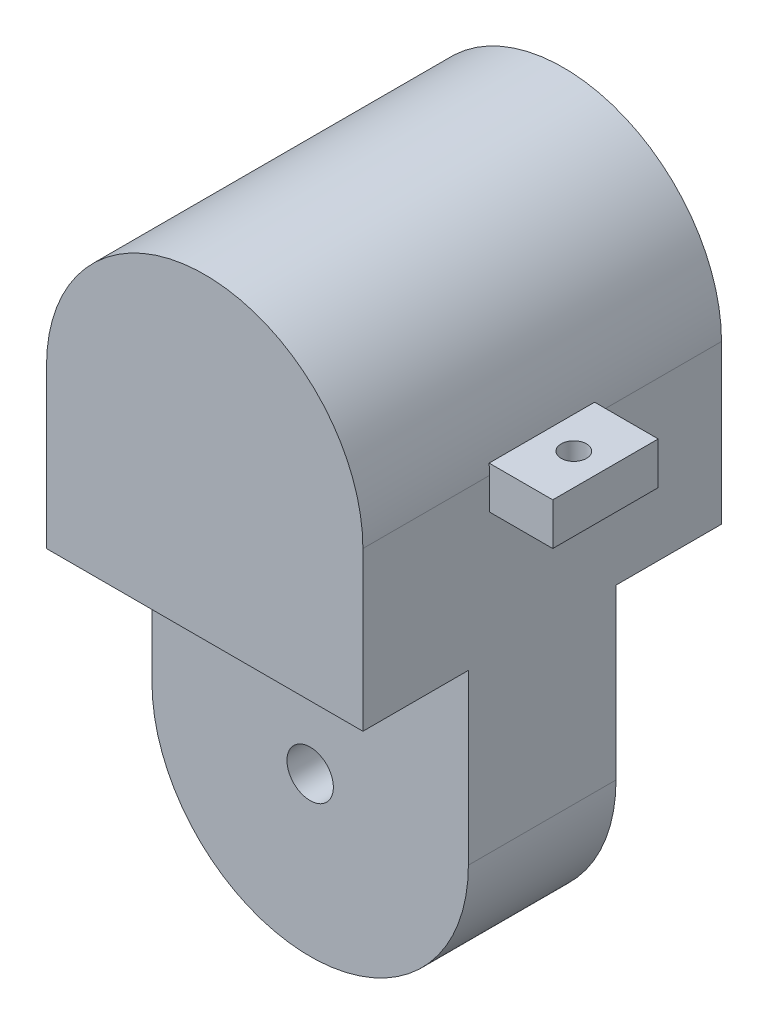
ISO-10303-21;
HEADER;
FILE_DESCRIPTION(('STEP AP214'),'2;1');
FILE_NAME('part.step','',(''),(''),'','','');
FILE_SCHEMA(('AUTOMOTIVE_DESIGN { 1 0 10303 214 1 1 1 1 }'));
ENDSEC;
DATA;
#1=APPLICATION_CONTEXT('core data for automotive mechanical design processes');
#2=APPLICATION_PROTOCOL_DEFINITION('international standard','automotive_design',2000,#1);
#3=PRODUCT_CONTEXT('',#1,'mechanical');
#4=PRODUCT('Part','Part','',(#3));
#5=PRODUCT_RELATED_PRODUCT_CATEGORY('part','',(#4));
#6=PRODUCT_DEFINITION_FORMATION('','',#4);
#7=PRODUCT_DEFINITION_CONTEXT('part definition',#1,'design');
#8=PRODUCT_DEFINITION('design','',#6,#7);
#9=PRODUCT_DEFINITION_SHAPE('','',#8);
#10=(LENGTH_UNIT() NAMED_UNIT(*) SI_UNIT(.MILLI.,.METRE.));
#11=(NAMED_UNIT(*) PLANE_ANGLE_UNIT() SI_UNIT($,.RADIAN.));
#12=(NAMED_UNIT(*) SI_UNIT($,.STERADIAN.) SOLID_ANGLE_UNIT());
#13=UNCERTAINTY_MEASURE_WITH_UNIT(LENGTH_MEASURE(1.E-05),#10,'distance_accuracy_value','');
#14=(GEOMETRIC_REPRESENTATION_CONTEXT(3) GLOBAL_UNCERTAINTY_ASSIGNED_CONTEXT((#13)) GLOBAL_UNIT_ASSIGNED_CONTEXT((#10,
#11,#12)) REPRESENTATION_CONTEXT('',''));
#15=CARTESIAN_POINT('',(0.,0.,0.));
#16=DIRECTION('',(0.,0.,1.));
#17=DIRECTION('',(1.,0.,0.));
#18=AXIS2_PLACEMENT_3D('',#15,#16,#17);
#19=CARTESIAN_POINT('',(7.5,0.,8.5));
#20=DIRECTION('',(-1.,0.,0.));
#21=DIRECTION('',(0.,0.,1.));
#22=AXIS2_PLACEMENT_3D('',#19,#20,#21);
#23=PLANE('',#22);
#24=DIRECTION('',(0.,0.,-1.));
#25=VECTOR('',#24,1.);
#26=CARTESIAN_POINT('',(7.5,14.,8.5));
#27=LINE('',#26,#25);
#28=CARTESIAN_POINT('',(7.5,14.,2.5));
#29=VERTEX_POINT('',#28);
#30=CARTESIAN_POINT('',(7.5,14.,-2.5));
#31=VERTEX_POINT('',#30);
#32=EDGE_CURVE('E11',#29,#31,#27,.T.);
#33=ORIENTED_EDGE('',*,*,#32,.F.);
#34=DIRECTION('',(0.,1.,0.));
#35=VECTOR('',#34,1.);
#36=CARTESIAN_POINT('',(7.5,0.,2.5));
#37=LINE('',#36,#35);
#38=CARTESIAN_POINT('',(7.5,15.5,2.5));
#39=VERTEX_POINT('',#38);
#40=EDGE_CURVE('E138',#29,#39,#37,.T.);
#41=ORIENTED_EDGE('',*,*,#40,.T.);
#42=DIRECTION('',(0.,0.,-1.));
#43=VECTOR('',#42,1.);
#44=CARTESIAN_POINT('',(7.5,15.5,8.5));
#45=LINE('',#44,#43);
#46=CARTESIAN_POINT('',(7.5,15.5,8.5));
#47=VERTEX_POINT('',#46);
#48=EDGE_CURVE('E221',#47,#39,#45,.T.);
#49=ORIENTED_EDGE('',*,*,#48,.F.);
#50=DIRECTION('',(0.,1.,0.));
#51=VECTOR('',#50,1.);
#52=CARTESIAN_POINT('',(7.5,0.,8.5));
#53=LINE('',#52,#51);
#54=CARTESIAN_POINT('',(7.5,7.99813007926781,8.5));
#55=VERTEX_POINT('',#54);
#56=EDGE_CURVE('E197',#55,#47,#53,.T.);
#57=ORIENTED_EDGE('',*,*,#56,.F.);
#58=DIRECTION('',(0.,0.,1.));
#59=VECTOR('',#58,1.);
#60=CARTESIAN_POINT('',(7.5,7.99813007926781,3.5));
#61=LINE('',#60,#59);
#62=CARTESIAN_POINT('',(7.5,7.99813007926781,3.5));
#63=VERTEX_POINT('',#62);
#64=EDGE_CURVE('E189',#63,#55,#61,.T.);
#65=ORIENTED_EDGE('',*,*,#64,.F.);
#66=DIRECTION('',(0.,1.,0.));
#67=VECTOR('',#66,1.);
#68=CARTESIAN_POINT('',(7.5,-8.,3.5));
#69=LINE('',#68,#67);
#70=CARTESIAN_POINT('',(7.5,0.,3.5));
#71=VERTEX_POINT('',#70);
#72=EDGE_CURVE('E234',#71,#63,#69,.T.);
#73=ORIENTED_EDGE('',*,*,#72,.F.);
#74=DIRECTION('',(0.,0.,-1.));
#75=VECTOR('',#74,1.);
#76=CARTESIAN_POINT('',(7.5,0.,8.5));
#77=LINE('',#76,#75);
#78=CARTESIAN_POINT('',(7.5,0.,-3.5));
#79=VERTEX_POINT('',#78);
#80=EDGE_CURVE('E223',#71,#79,#77,.T.);
#81=ORIENTED_EDGE('',*,*,#80,.T.);
#82=DIRECTION('',(0.,-1.,0.));
#83=VECTOR('',#82,1.);
#84=CARTESIAN_POINT('',(7.5,-8.,-3.5));
#85=LINE('',#84,#83);
#86=CARTESIAN_POINT('',(7.5,7.99813007926781,-3.5));
#87=VERTEX_POINT('',#86);
#88=EDGE_CURVE('E236',#87,#79,#85,.T.);
#89=ORIENTED_EDGE('',*,*,#88,.F.);
#90=DIRECTION('',(0.,0.,1.));
#91=VECTOR('',#90,1.);
#92=CARTESIAN_POINT('',(7.5,7.99813007926781,-3.5));
#93=LINE('',#92,#91);
#94=CARTESIAN_POINT('',(7.5,7.99813007926781,-8.5));
#95=VERTEX_POINT('',#94);
#96=EDGE_CURVE('E178',#95,#87,#93,.T.);
#97=ORIENTED_EDGE('',*,*,#96,.F.);
#98=DIRECTION('',(0.,1.,0.));
#99=VECTOR('',#98,1.);
#100=CARTESIAN_POINT('',(7.5,0.,-8.5));
#101=LINE('',#100,#99);
#102=CARTESIAN_POINT('',(7.5,15.5,-8.5));
#103=VERTEX_POINT('',#102);
#104=EDGE_CURVE('E199',#95,#103,#101,.T.);
#105=ORIENTED_EDGE('',*,*,#104,.T.);
#106=CARTESIAN_POINT('',(7.5,15.5,-2.5));
#107=VERTEX_POINT('',#106);
#108=EDGE_CURVE('E217',#107,#103,#45,.T.);
#109=ORIENTED_EDGE('',*,*,#108,.F.);
#110=DIRECTION('',(0.,1.,0.));
#111=VECTOR('',#110,1.);
#112=CARTESIAN_POINT('',(7.5,0.,-2.5));
#113=LINE('',#112,#111);
#114=EDGE_CURVE('E59',#31,#107,#113,.T.);
#115=ORIENTED_EDGE('',*,*,#114,.F.);
#116=EDGE_LOOP('',(#33,#41,#49,#57,#65,#73,#81,#89,#97,#105,#109,#115));
#117=FACE_BOUND('',#116,.T.);
#118=ADVANCED_FACE('F39',(#117),#23,.F.);
#119=CARTESIAN_POINT('',(0.,0.,8.5));
#120=DIRECTION('',(0.,0.,-1.));
#121=DIRECTION('',(-1.,0.,0.));
#122=AXIS2_PLACEMENT_3D('',#119,#120,#121);
#123=CYLINDRICAL_SURFACE('',#122,7.5);
#124=DIRECTION('',(0.,0.,-1.));
#125=VECTOR('',#124,1.);
#126=CARTESIAN_POINT('',(-7.5,0.,8.5));
#127=LINE('',#126,#125);
#128=CARTESIAN_POINT('',(-7.5,0.,3.5));
#129=VERTEX_POINT('',#128);
#130=CARTESIAN_POINT('',(-7.5,0.,-3.5));
#131=VERTEX_POINT('',#130);
#132=EDGE_CURVE('E206',#129,#131,#127,.T.);
#133=ORIENTED_EDGE('',*,*,#132,.T.);
#134=CARTESIAN_POINT('',(0.,0.,-3.5));
#135=DIRECTION('',(0.,0.,1.));
#136=DIRECTION('',(1.,0.,0.));
#137=AXIS2_PLACEMENT_3D('',#134,#135,#136);
#138=CIRCLE('',#137,7.5);
#139=EDGE_CURVE('E198',#131,#79,#138,.T.);
#140=ORIENTED_EDGE('',*,*,#139,.T.);
#141=ORIENTED_EDGE('',*,*,#80,.F.);
#142=CARTESIAN_POINT('',(0.,0.,3.5));
#143=DIRECTION('',(0.,0.,-1.));
#144=DIRECTION('',(-1.,0.,0.));
#145=AXIS2_PLACEMENT_3D('',#142,#143,#144);
#146=CIRCLE('',#145,7.5);
#147=EDGE_CURVE('E192',#71,#129,#146,.T.);
#148=ORIENTED_EDGE('',*,*,#147,.T.);
#149=EDGE_LOOP('',(#133,#140,#141,#148));
#150=FACE_BOUND('',#149,.T.);
#151=ADVANCED_FACE('F41',(#150),#123,.T.);
#152=CARTESIAN_POINT('',(0.,15.5,8.5));
#153=DIRECTION('',(0.,0.,-1.));
#154=DIRECTION('',(-1.,0.,0.));
#155=AXIS2_PLACEMENT_3D('',#152,#153,#154);
#156=CYLINDRICAL_SURFACE('',#155,7.5);
#157=ORIENTED_EDGE('',*,*,#48,.T.);
#158=CARTESIAN_POINT('',(0.,15.5,2.5));
#159=DIRECTION('',(0.,0.,1.));
#160=DIRECTION('',(1.,0.,0.));
#161=AXIS2_PLACEMENT_3D('',#158,#159,#160);
#162=CIRCLE('',#161,7.5);
#163=CARTESIAN_POINT('',(7.48331477354788,16.,2.5));
#164=VERTEX_POINT('',#163);
#165=EDGE_CURVE('E48',#39,#164,#162,.T.);
#166=ORIENTED_EDGE('',*,*,#165,.T.);
#167=DIRECTION('',(0.,0.,-1.));
#168=VECTOR('',#167,1.);
#169=CARTESIAN_POINT('',(7.48331477354788,16.,8.5));
#170=LINE('',#169,#168);
#171=CARTESIAN_POINT('',(7.48331477354788,16.,-2.5));
#172=VERTEX_POINT('',#171);
#173=EDGE_CURVE('E243',#172,#164,#170,.F.);
#174=ORIENTED_EDGE('',*,*,#173,.F.);
#175=CARTESIAN_POINT('',(0.,15.5,-2.5));
#176=DIRECTION('',(0.,0.,1.));
#177=DIRECTION('',(1.,0.,0.));
#178=AXIS2_PLACEMENT_3D('',#175,#176,#177);
#179=CIRCLE('',#178,7.5);
#180=EDGE_CURVE('E235',#107,#172,#179,.T.);
#181=ORIENTED_EDGE('',*,*,#180,.F.);
#182=ORIENTED_EDGE('',*,*,#108,.T.);
#183=CARTESIAN_POINT('',(0.,15.5,-8.5));
#184=DIRECTION('',(0.,0.,1.));
#185=DIRECTION('',(1.,0.,0.));
#186=AXIS2_PLACEMENT_3D('',#183,#184,#185);
#187=CIRCLE('',#186,7.5);
#188=CARTESIAN_POINT('',(-7.5,15.5,-8.5));
#189=VERTEX_POINT('',#188);
#190=EDGE_CURVE('E212',#103,#189,#187,.T.);
#191=ORIENTED_EDGE('',*,*,#190,.T.);
#192=DIRECTION('',(0.,0.,-1.));
#193=VECTOR('',#192,1.);
#194=CARTESIAN_POINT('',(-7.5,15.5,8.5));
#195=LINE('',#194,#193);
#196=CARTESIAN_POINT('',(-7.5,15.5,8.5));
#197=VERTEX_POINT('',#196);
#198=EDGE_CURVE('E220',#197,#189,#195,.T.);
#199=ORIENTED_EDGE('',*,*,#198,.F.);
#200=CARTESIAN_POINT('',(0.,15.5,8.5));
#201=DIRECTION('',(0.,0.,1.));
#202=DIRECTION('',(1.,0.,0.));
#203=AXIS2_PLACEMENT_3D('',#200,#201,#202);
#204=CIRCLE('',#203,7.5);
#205=EDGE_CURVE('E205',#47,#197,#204,.T.);
#206=ORIENTED_EDGE('',*,*,#205,.F.);
#207=EDGE_LOOP('',(#157,#166,#174,#181,#182,#191,#199,#206));
#208=FACE_BOUND('',#207,.T.);
#209=ADVANCED_FACE('F250',(#208),#156,.T.);
#210=CARTESIAN_POINT('',(-7.5,0.,8.5));
#211=DIRECTION('',(1.,0.,0.));
#212=DIRECTION('',(0.,0.,-1.));
#213=AXIS2_PLACEMENT_3D('',#210,#211,#212);
#214=PLANE('',#213);
#215=DIRECTION('',(0.,0.,1.));
#216=VECTOR('',#215,1.);
#217=CARTESIAN_POINT('',(-7.5,7.99813007926781,-3.5));
#218=LINE('',#217,#216);
#219=CARTESIAN_POINT('',(-7.5,7.99813007926781,-8.5));
#220=VERTEX_POINT('',#219);
#221=CARTESIAN_POINT('',(-7.5,7.99813007926781,-3.5));
#222=VERTEX_POINT('',#221);
#223=EDGE_CURVE('E180',#220,#222,#218,.T.);
#224=ORIENTED_EDGE('',*,*,#223,.T.);
#225=DIRECTION('',(0.,-1.,0.));
#226=VECTOR('',#225,1.);
#227=CARTESIAN_POINT('',(-7.5,-8.,-3.5));
#228=LINE('',#227,#226);
#229=EDGE_CURVE('E172',#222,#131,#228,.T.);
#230=ORIENTED_EDGE('',*,*,#229,.T.);
#231=ORIENTED_EDGE('',*,*,#132,.F.);
#232=DIRECTION('',(0.,1.,0.));
#233=VECTOR('',#232,1.);
#234=CARTESIAN_POINT('',(-7.5,-8.,3.5));
#235=LINE('',#234,#233);
#236=CARTESIAN_POINT('',(-7.5,7.99813007926781,3.5));
#237=VERTEX_POINT('',#236);
#238=EDGE_CURVE('E184',#129,#237,#235,.T.);
#239=ORIENTED_EDGE('',*,*,#238,.T.);
#240=DIRECTION('',(0.,0.,1.));
#241=VECTOR('',#240,1.);
#242=CARTESIAN_POINT('',(-7.5,7.99813007926781,3.5));
#243=LINE('',#242,#241);
#244=CARTESIAN_POINT('',(-7.5,7.99813007926781,8.5));
#245=VERTEX_POINT('',#244);
#246=EDGE_CURVE('E185',#237,#245,#243,.T.);
#247=ORIENTED_EDGE('',*,*,#246,.T.);
#248=DIRECTION('',(0.,-1.,0.));
#249=VECTOR('',#248,1.);
#250=CARTESIAN_POINT('',(-7.5,0.,8.5));
#251=LINE('',#250,#249);
#252=EDGE_CURVE('E204',#197,#245,#251,.T.);
#253=ORIENTED_EDGE('',*,*,#252,.F.);
#254=ORIENTED_EDGE('',*,*,#198,.T.);
#255=DIRECTION('',(0.,-1.,0.));
#256=VECTOR('',#255,1.);
#257=CARTESIAN_POINT('',(-7.5,0.,-8.5));
#258=LINE('',#257,#256);
#259=EDGE_CURVE('E202',#189,#220,#258,.T.);
#260=ORIENTED_EDGE('',*,*,#259,.T.);
#261=EDGE_LOOP('',(#224,#230,#231,#239,#247,#253,#254,#260));
#262=FACE_BOUND('',#261,.T.);
#263=ADVANCED_FACE('F262',(#262),#214,.F.);
#264=CARTESIAN_POINT('',(0.,0.,8.5));
#265=DIRECTION('',(0.,0.,1.));
#266=DIRECTION('',(1.,0.,0.));
#267=AXIS2_PLACEMENT_3D('',#264,#265,#266);
#268=PLANE('',#267);
#269=DIRECTION('',(-1.,0.,0.));
#270=VECTOR('',#269,1.);
#271=CARTESIAN_POINT('',(0.,7.99813007926781,8.5));
#272=LINE('',#271,#270);
#273=EDGE_CURVE('E226',#55,#245,#272,.T.);
#274=ORIENTED_EDGE('',*,*,#273,.F.);
#275=ORIENTED_EDGE('',*,*,#56,.T.);
#276=ORIENTED_EDGE('',*,*,#205,.T.);
#277=ORIENTED_EDGE('',*,*,#252,.T.);
#278=EDGE_LOOP('',(#274,#275,#276,#277));
#279=FACE_BOUND('',#278,.T.);
#280=ADVANCED_FACE('F268',(#279),#268,.T.);
#281=CARTESIAN_POINT('',(0.,0.,-8.5));
#282=DIRECTION('',(0.,0.,1.));
#283=DIRECTION('',(1.,0.,0.));
#284=AXIS2_PLACEMENT_3D('',#281,#282,#283);
#285=PLANE('',#284);
#286=ORIENTED_EDGE('',*,*,#104,.F.);
#287=DIRECTION('',(-1.,0.,0.));
#288=VECTOR('',#287,1.);
#289=CARTESIAN_POINT('',(0.,7.99813007926781,-8.5));
#290=LINE('',#289,#288);
#291=EDGE_CURVE('E224',#95,#220,#290,.T.);
#292=ORIENTED_EDGE('',*,*,#291,.T.);
#293=ORIENTED_EDGE('',*,*,#259,.F.);
#294=ORIENTED_EDGE('',*,*,#190,.F.);
#295=EDGE_LOOP('',(#286,#292,#293,#294));
#296=FACE_BOUND('',#295,.T.);
#297=ADVANCED_FACE('F263',(#296),#285,.F.);
#298=CARTESIAN_POINT('',(-7.5,-8.,-3.5));
#299=DIRECTION('',(0.,0.,1.));
#300=DIRECTION('',(1.,0.,0.));
#301=AXIS2_PLACEMENT_3D('',#298,#299,#300);
#302=PLANE('',#301);
#303=CARTESIAN_POINT('',(0.,0.,-3.5));
#304=DIRECTION('',(0.,0.,1.));
#305=DIRECTION('',(1.,0.,0.));
#306=AXIS2_PLACEMENT_3D('',#303,#304,#305);
#307=CIRCLE('',#306,1.1);
#308=CARTESIAN_POINT('',(1.1,0.,-3.5));
#309=VERTEX_POINT('',#308);
#310=EDGE_CURVE('E167',#309,#309,#307,.T.);
#311=ORIENTED_EDGE('',*,*,#310,.T.);
#312=EDGE_LOOP('',(#311));
#313=FACE_BOUND('',#312,.T.);
#314=ORIENTED_EDGE('',*,*,#229,.F.);
#315=DIRECTION('',(1.,0.,0.));
#316=VECTOR('',#315,1.);
#317=CARTESIAN_POINT('',(-7.5,7.99813007926781,-3.5));
#318=LINE('',#317,#316);
#319=EDGE_CURVE('E181',#222,#87,#318,.T.);
#320=ORIENTED_EDGE('',*,*,#319,.T.);
#321=ORIENTED_EDGE('',*,*,#88,.T.);
#322=ORIENTED_EDGE('',*,*,#139,.F.);
#323=EDGE_LOOP('',(#314,#320,#321,#322));
#324=FACE_BOUND('',#323,.T.);
#325=ADVANCED_FACE('F285',(#313,#324),#302,.F.);
#326=CARTESIAN_POINT('',(-7.5,7.99813007926781,-3.5));
#327=DIRECTION('',(0.,1.,0.));
#328=DIRECTION('',(0.,0.,1.));
#329=AXIS2_PLACEMENT_3D('',#326,#327,#328);
#330=PLANE('',#329);
#331=ORIENTED_EDGE('',*,*,#96,.T.);
#332=ORIENTED_EDGE('',*,*,#319,.F.);
#333=ORIENTED_EDGE('',*,*,#223,.F.);
#334=ORIENTED_EDGE('',*,*,#291,.F.);
#335=EDGE_LOOP('',(#331,#332,#333,#334));
#336=FACE_BOUND('',#335,.T.);
#337=ADVANCED_FACE('F284',(#336),#330,.F.);
#338=CARTESIAN_POINT('',(-7.5,-8.,3.5));
#339=DIRECTION('',(0.,0.,-1.));
#340=DIRECTION('',(-1.,0.,0.));
#341=AXIS2_PLACEMENT_3D('',#338,#339,#340);
#342=PLANE('',#341);
#343=CARTESIAN_POINT('',(0.,0.,3.5));
#344=DIRECTION('',(0.,0.,-1.));
#345=DIRECTION('',(-1.,0.,0.));
#346=AXIS2_PLACEMENT_3D('',#343,#344,#345);
#347=CIRCLE('',#346,1.1);
#348=CARTESIAN_POINT('',(1.1,0.,3.5));
#349=VERTEX_POINT('',#348);
#350=EDGE_CURVE('E169',#349,#349,#347,.T.);
#351=ORIENTED_EDGE('',*,*,#350,.T.);
#352=EDGE_LOOP('',(#351));
#353=FACE_BOUND('',#352,.T.);
#354=ORIENTED_EDGE('',*,*,#72,.T.);
#355=DIRECTION('',(1.,0.,0.));
#356=VECTOR('',#355,1.);
#357=CARTESIAN_POINT('',(-7.5,7.99813007926781,3.5));
#358=LINE('',#357,#356);
#359=EDGE_CURVE('E173',#237,#63,#358,.T.);
#360=ORIENTED_EDGE('',*,*,#359,.F.);
#361=ORIENTED_EDGE('',*,*,#238,.F.);
#362=ORIENTED_EDGE('',*,*,#147,.F.);
#363=EDGE_LOOP('',(#354,#360,#361,#362));
#364=FACE_BOUND('',#363,.T.);
#365=ADVANCED_FACE('F280',(#353,#364),#342,.F.);
#366=CARTESIAN_POINT('',(-7.5,7.99813007926781,3.5));
#367=DIRECTION('',(0.,1.,0.));
#368=DIRECTION('',(0.,0.,1.));
#369=AXIS2_PLACEMENT_3D('',#366,#367,#368);
#370=PLANE('',#369);
#371=ORIENTED_EDGE('',*,*,#273,.T.);
#372=ORIENTED_EDGE('',*,*,#246,.F.);
#373=ORIENTED_EDGE('',*,*,#359,.T.);
#374=ORIENTED_EDGE('',*,*,#64,.T.);
#375=EDGE_LOOP('',(#371,#372,#373,#374));
#376=FACE_BOUND('',#375,.T.);
#377=ADVANCED_FACE('F273',(#376),#370,.F.);
#378=CARTESIAN_POINT('',(0.,0.,-8.5));
#379=DIRECTION('',(0.,0.,1.));
#380=DIRECTION('',(1.,0.,0.));
#381=AXIS2_PLACEMENT_3D('',#378,#379,#380);
#382=CYLINDRICAL_SURFACE('',#381,1.1);
#383=CARTESIAN_POINT('',(1.1,0.,3.5));
#384=CARTESIAN_POINT('',(1.1,0.,3.42708333333333));
#385=CARTESIAN_POINT('',(1.1,0.,3.35416666666667));
#386=CARTESIAN_POINT('',(1.1,0.,3.20833333333333));
#387=CARTESIAN_POINT('',(1.1,0.,3.13541666666667));
#388=CARTESIAN_POINT('',(1.1,0.,2.98958333333333));
#389=CARTESIAN_POINT('',(1.1,0.,2.91666666666667));
#390=CARTESIAN_POINT('',(1.1,0.,2.77083333333333));
#391=CARTESIAN_POINT('',(1.1,0.,2.69791666666667));
#392=CARTESIAN_POINT('',(1.1,0.,2.55208333333333));
#393=CARTESIAN_POINT('',(1.1,0.,2.47916666666667));
#394=CARTESIAN_POINT('',(1.1,0.,2.33333333333333));
#395=CARTESIAN_POINT('',(1.1,0.,2.26041666666667));
#396=CARTESIAN_POINT('',(1.1,0.,2.11458333333333));
#397=CARTESIAN_POINT('',(1.1,0.,2.04166666666667));
#398=CARTESIAN_POINT('',(1.1,0.,1.89583333333333));
#399=CARTESIAN_POINT('',(1.1,0.,1.82291666666667));
#400=CARTESIAN_POINT('',(1.1,0.,1.67708333333333));
#401=CARTESIAN_POINT('',(1.1,0.,1.60416666666667));
#402=CARTESIAN_POINT('',(1.1,0.,1.45833333333333));
#403=CARTESIAN_POINT('',(1.1,0.,1.38541666666667));
#404=CARTESIAN_POINT('',(1.1,0.,1.23958333333333));
#405=CARTESIAN_POINT('',(1.1,0.,1.16666666666667));
#406=CARTESIAN_POINT('',(1.1,0.,1.02083333333333));
#407=CARTESIAN_POINT('',(1.1,0.,0.947916666666667));
#408=CARTESIAN_POINT('',(1.1,0.,0.802083333333334));
#409=CARTESIAN_POINT('',(1.1,0.,0.729166666666667));
#410=CARTESIAN_POINT('',(1.1,0.,0.583333333333334));
#411=CARTESIAN_POINT('',(1.1,0.,0.510416666666667));
#412=CARTESIAN_POINT('',(1.1,0.,0.364583333333334));
#413=CARTESIAN_POINT('',(1.1,0.,0.291666666666667));
#414=CARTESIAN_POINT('',(1.1,0.,0.145833333333333));
#415=CARTESIAN_POINT('',(1.1,0.,0.0729166666666667));
#416=CARTESIAN_POINT('',(1.1,0.,-0.0729166666666667));
#417=CARTESIAN_POINT('',(1.1,0.,-0.145833333333333));
#418=CARTESIAN_POINT('',(1.1,0.,-0.291666666666667));
#419=CARTESIAN_POINT('',(1.1,0.,-0.364583333333334));
#420=CARTESIAN_POINT('',(1.1,0.,-0.510416666666667));
#421=CARTESIAN_POINT('',(1.1,0.,-0.583333333333334));
#422=CARTESIAN_POINT('',(1.1,0.,-0.729166666666667));
#423=CARTESIAN_POINT('',(1.1,0.,-0.802083333333333));
#424=CARTESIAN_POINT('',(1.1,0.,-0.947916666666667));
#425=CARTESIAN_POINT('',(1.1,0.,-1.02083333333333));
#426=CARTESIAN_POINT('',(1.1,0.,-1.16666666666667));
#427=CARTESIAN_POINT('',(1.1,0.,-1.23958333333333));
#428=CARTESIAN_POINT('',(1.1,0.,-1.38541666666667));
#429=CARTESIAN_POINT('',(1.1,0.,-1.45833333333333));
#430=CARTESIAN_POINT('',(1.1,0.,-1.60416666666667));
#431=CARTESIAN_POINT('',(1.1,0.,-1.67708333333333));
#432=CARTESIAN_POINT('',(1.1,0.,-1.82291666666667));
#433=CARTESIAN_POINT('',(1.1,0.,-1.89583333333333));
#434=CARTESIAN_POINT('',(1.1,0.,-2.04166666666667));
#435=CARTESIAN_POINT('',(1.1,0.,-2.11458333333333));
#436=CARTESIAN_POINT('',(1.1,0.,-2.26041666666667));
#437=CARTESIAN_POINT('',(1.1,0.,-2.33333333333333));
#438=CARTESIAN_POINT('',(1.1,0.,-2.47916666666667));
#439=CARTESIAN_POINT('',(1.1,0.,-2.55208333333333));
#440=CARTESIAN_POINT('',(1.1,0.,-2.69791666666667));
#441=CARTESIAN_POINT('',(1.1,0.,-2.77083333333333));
#442=CARTESIAN_POINT('',(1.1,0.,-2.91666666666667));
#443=CARTESIAN_POINT('',(1.1,0.,-2.98958333333333));
#444=CARTESIAN_POINT('',(1.1,0.,-3.13541666666667));
#445=CARTESIAN_POINT('',(1.1,0.,-3.20833333333333));
#446=CARTESIAN_POINT('',(1.1,0.,-3.35416666666667));
#447=CARTESIAN_POINT('',(1.1,0.,-3.42708333333333));
#448=CARTESIAN_POINT('',(1.1,0.,-3.5));
#449=B_SPLINE_CURVE_WITH_KNOTS('',3,(#383,#384,#385,#386,#387,#388,#389,#390,#391,#392,#393,
#394,#395,#396,#397,#398,#399,#400,#401,#402,#403,#404,#405,#406,#407,#408,#409,#410,#411,#412,
#413,#414,#415,#416,#417,#418,#419,#420,#421,#422,#423,#424,#425,#426,#427,#428,#429,#430,#431,
#432,#433,#434,#435,#436,#437,#438,#439,#440,#441,#442,#443,#444,#445,#446,#447,#448),
.UNSPECIFIED.,.F.,.F.,(4,2,2,2,2,2,2,2,2,2,2,2,2,2,2,2,2,2,2,2,2,2,2,2,2,2,2,2,2,2,2,2,4),(0.,
0.21875,0.4375,0.656250000000001,0.875000000000001,1.09375,1.3125,1.53125,1.75,1.96875,2.1875,
2.40625,2.625,2.84375,3.0625,3.28125,3.5,3.71875,3.9375,4.15625,4.375,4.59375,4.8125,5.03125,
5.25,5.46875,5.6875,5.90625,6.125,6.34375,6.5625,6.78125,7.),.UNSPECIFIED.);
#450=EDGE_CURVE('BSEAM311',#349,#309,#449,.T.);
#451=ORIENTED_EDGE('',*,*,#350,.F.);
#452=ORIENTED_EDGE('',*,*,#310,.F.);
#453=ORIENTED_EDGE('',*,*,#450,.T.);
#454=ORIENTED_EDGE('',*,*,#450,.F.);
#455=EDGE_LOOP('',(#451,#453,#452,#454));
#456=FACE_BOUND('',#455,.T.);
#457=ADVANCED_FACE('F311',(#456),#382,.F.);
#458=CARTESIAN_POINT('',(7.,14.,2.5));
#459=DIRECTION('',(0.,1.,0.));
#460=DIRECTION('',(-1.,0.,0.));
#461=AXIS2_PLACEMENT_3D('',#458,#459,#460);
#462=PLANE('',#461);
#463=CARTESIAN_POINT('',(9.,14.,0.));
#464=DIRECTION('',(0.,1.,0.));
#465=DIRECTION('',(-1.,0.,0.));
#466=AXIS2_PLACEMENT_3D('',#463,#464,#465);
#467=CIRCLE('',#466,0.6);
#468=CARTESIAN_POINT('',(8.4,14.,0.));
#469=VERTEX_POINT('',#468);
#470=EDGE_CURVE('E162',#469,#469,#467,.F.);
#471=ORIENTED_EDGE('',*,*,#470,.F.);
#472=EDGE_LOOP('',(#471));
#473=FACE_BOUND('',#472,.T.);
#474=DIRECTION('',(1.,0.,0.));
#475=VECTOR('',#474,1.);
#476=CARTESIAN_POINT('',(7.,14.,2.5));
#477=LINE('',#476,#475);
#478=CARTESIAN_POINT('',(10.5,14.,2.5));
#479=VERTEX_POINT('',#478);
#480=EDGE_CURVE('E133',#29,#479,#477,.T.);
#481=ORIENTED_EDGE('',*,*,#480,.F.);
#482=ORIENTED_EDGE('',*,*,#32,.T.);
#483=DIRECTION('',(1.,0.,0.));
#484=VECTOR('',#483,1.);
#485=CARTESIAN_POINT('',(7.,14.,-2.5));
#486=LINE('',#485,#484);
#487=CARTESIAN_POINT('',(10.5,14.,-2.5));
#488=VERTEX_POINT('',#487);
#489=EDGE_CURVE('E150',#31,#488,#486,.T.);
#490=ORIENTED_EDGE('',*,*,#489,.T.);
#491=DIRECTION('',(0.,0.,-1.));
#492=VECTOR('',#491,1.);
#493=CARTESIAN_POINT('',(10.5,14.,2.5));
#494=LINE('',#493,#492);
#495=EDGE_CURVE('E144',#479,#488,#494,.T.);
#496=ORIENTED_EDGE('',*,*,#495,.F.);
#497=EDGE_LOOP('',(#481,#482,#490,#496));
#498=FACE_BOUND('',#497,.T.);
#499=ADVANCED_FACE('F143',(#473,#498),#462,.F.);
#500=CARTESIAN_POINT('',(7.,16.,2.5));
#501=DIRECTION('',(0.,-1.,0.));
#502=DIRECTION('',(0.,0.,-1.));
#503=AXIS2_PLACEMENT_3D('',#500,#501,#502);
#504=PLANE('',#503);
#505=CARTESIAN_POINT('',(9.,16.,0.));
#506=DIRECTION('',(0.,-1.,0.));
#507=DIRECTION('',(0.,0.,-1.));
#508=AXIS2_PLACEMENT_3D('',#505,#506,#507);
#509=CIRCLE('',#508,0.6);
#510=CARTESIAN_POINT('',(9.,16.,-0.6));
#511=VERTEX_POINT('',#510);
#512=EDGE_CURVE('E43',#511,#511,#509,.F.);
#513=ORIENTED_EDGE('',*,*,#512,.F.);
#514=EDGE_LOOP('',(#513));
#515=FACE_BOUND('',#514,.T.);
#516=DIRECTION('',(-1.,0.,0.));
#517=VECTOR('',#516,1.);
#518=CARTESIAN_POINT('',(7.,16.,-2.5));
#519=LINE('',#518,#517);
#520=CARTESIAN_POINT('',(10.5,16.,-2.5));
#521=VERTEX_POINT('',#520);
#522=EDGE_CURVE('E142',#521,#172,#519,.T.);
#523=ORIENTED_EDGE('',*,*,#522,.T.);
#524=ORIENTED_EDGE('',*,*,#173,.T.);
#525=DIRECTION('',(-1.,0.,0.));
#526=VECTOR('',#525,1.);
#527=CARTESIAN_POINT('',(7.,16.,2.5));
#528=LINE('',#527,#526);
#529=CARTESIAN_POINT('',(10.5,16.,2.5));
#530=VERTEX_POINT('',#529);
#531=EDGE_CURVE('E152',#530,#164,#528,.T.);
#532=ORIENTED_EDGE('',*,*,#531,.F.);
#533=DIRECTION('',(0.,0.,-1.));
#534=VECTOR('',#533,1.);
#535=CARTESIAN_POINT('',(10.5,16.,2.5));
#536=LINE('',#535,#534);
#537=EDGE_CURVE('E148',#530,#521,#536,.T.);
#538=ORIENTED_EDGE('',*,*,#537,.T.);
#539=EDGE_LOOP('',(#523,#524,#532,#538));
#540=FACE_BOUND('',#539,.T.);
#541=ADVANCED_FACE('F252',(#515,#540),#504,.F.);
#542=CARTESIAN_POINT('',(10.5,16.,2.5));
#543=DIRECTION('',(-1.,0.,0.));
#544=DIRECTION('',(0.,0.,1.));
#545=AXIS2_PLACEMENT_3D('',#542,#543,#544);
#546=PLANE('',#545);
#547=DIRECTION('',(0.,1.,0.));
#548=VECTOR('',#547,1.);
#549=CARTESIAN_POINT('',(10.5,16.,-2.5));
#550=LINE('',#549,#548);
#551=EDGE_CURVE('E163',#488,#521,#550,.T.);
#552=ORIENTED_EDGE('',*,*,#551,.T.);
#553=ORIENTED_EDGE('',*,*,#537,.F.);
#554=DIRECTION('',(0.,1.,0.));
#555=VECTOR('',#554,1.);
#556=CARTESIAN_POINT('',(10.5,16.,2.5));
#557=LINE('',#556,#555);
#558=EDGE_CURVE('E136',#479,#530,#557,.T.);
#559=ORIENTED_EDGE('',*,*,#558,.F.);
#560=ORIENTED_EDGE('',*,*,#495,.T.);
#561=EDGE_LOOP('',(#552,#553,#559,#560));
#562=FACE_BOUND('',#561,.T.);
#563=ADVANCED_FACE('F155',(#562),#546,.F.);
#564=CARTESIAN_POINT('',(0.,0.,2.5));
#565=DIRECTION('',(0.,0.,1.));
#566=DIRECTION('',(1.,0.,0.));
#567=AXIS2_PLACEMENT_3D('',#564,#565,#566);
#568=PLANE('',#567);
#569=ORIENTED_EDGE('',*,*,#40,.F.);
#570=ORIENTED_EDGE('',*,*,#480,.T.);
#571=ORIENTED_EDGE('',*,*,#558,.T.);
#572=ORIENTED_EDGE('',*,*,#531,.T.);
#573=ORIENTED_EDGE('',*,*,#165,.F.);
#574=EDGE_LOOP('',(#569,#570,#571,#572,#573));
#575=FACE_BOUND('',#574,.T.);
#576=ADVANCED_FACE('F131',(#575),#568,.T.);
#577=CARTESIAN_POINT('',(0.,0.,-2.5));
#578=DIRECTION('',(0.,0.,1.));
#579=DIRECTION('',(1.,0.,0.));
#580=AXIS2_PLACEMENT_3D('',#577,#578,#579);
#581=PLANE('',#580);
#582=ORIENTED_EDGE('',*,*,#489,.F.);
#583=ORIENTED_EDGE('',*,*,#114,.T.);
#584=ORIENTED_EDGE('',*,*,#180,.T.);
#585=ORIENTED_EDGE('',*,*,#522,.F.);
#586=ORIENTED_EDGE('',*,*,#551,.F.);
#587=EDGE_LOOP('',(#582,#583,#584,#585,#586));
#588=FACE_BOUND('',#587,.T.);
#589=ADVANCED_FACE('F251',(#588),#581,.F.);
#590=CARTESIAN_POINT('',(9.,23.,0.));
#591=DIRECTION('',(0.,-1.,0.));
#592=DIRECTION('',(0.,0.,-1.));
#593=AXIS2_PLACEMENT_3D('',#590,#591,#592);
#594=CYLINDRICAL_SURFACE('',#593,0.6);
#595=ORIENTED_EDGE('',*,*,#512,.T.);
#596=EDGE_LOOP('',(#595));
#597=FACE_BOUND('',#596,.T.);
#598=ORIENTED_EDGE('',*,*,#470,.T.);
#599=EDGE_LOOP('',(#598));
#600=FACE_BOUND('',#599,.T.);
#601=ADVANCED_FACE('F327',(#597,#600),#594,.F.);
#602=CLOSED_SHELL('',(#118,#151,#209,#263,#280,#297,#325,#337,#365,#377,#457,#499,#541,#563,
#576,#589,#601));
#603=MANIFOLD_SOLID_BREP('B2',#602);
#604=ADVANCED_BREP_SHAPE_REPRESENTATION('',(#18,#603),#14);
#605=SHAPE_DEFINITION_REPRESENTATION(#9,#604);
ENDSEC;
END-ISO-10303-21;
